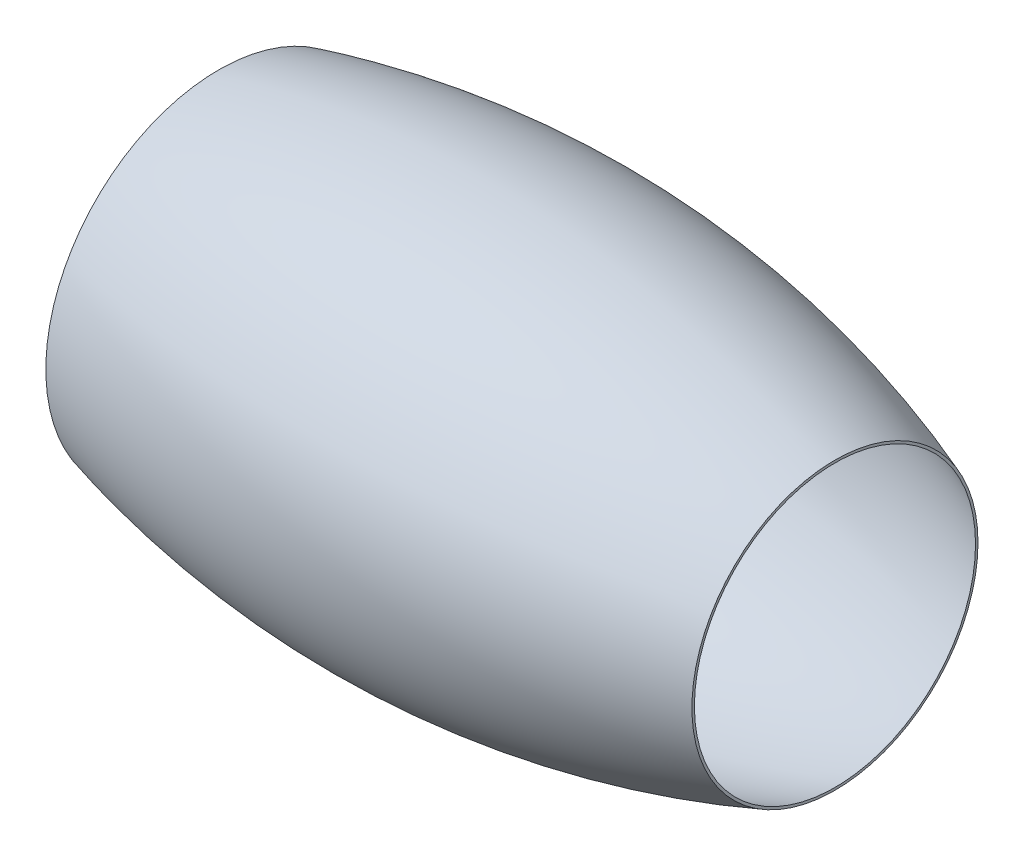
ISO-10303-21;
HEADER;
FILE_DESCRIPTION(('STEP AP214'),'2;1');
FILE_NAME('part.step','',(''),(''),'','','');
FILE_SCHEMA(('AUTOMOTIVE_DESIGN { 1 0 10303 214 1 1 1 1 }'));
ENDSEC;
DATA;
#1=APPLICATION_CONTEXT('core data for automotive mechanical design processes');
#2=APPLICATION_PROTOCOL_DEFINITION('international standard','automotive_design',2000,#1);
#3=PRODUCT_CONTEXT('',#1,'mechanical');
#4=PRODUCT('Part','Part','',(#3));
#5=PRODUCT_RELATED_PRODUCT_CATEGORY('part','',(#4));
#6=PRODUCT_DEFINITION_FORMATION('','',#4);
#7=PRODUCT_DEFINITION_CONTEXT('part definition',#1,'design');
#8=PRODUCT_DEFINITION('design','',#6,#7);
#9=PRODUCT_DEFINITION_SHAPE('','',#8);
#10=(LENGTH_UNIT() NAMED_UNIT(*) SI_UNIT(.MILLI.,.METRE.));
#11=(NAMED_UNIT(*) PLANE_ANGLE_UNIT() SI_UNIT($,.RADIAN.));
#12=(NAMED_UNIT(*) SI_UNIT($,.STERADIAN.) SOLID_ANGLE_UNIT());
#13=UNCERTAINTY_MEASURE_WITH_UNIT(LENGTH_MEASURE(1.E-05),#10,'distance_accuracy_value','');
#14=(GEOMETRIC_REPRESENTATION_CONTEXT(3) GLOBAL_UNCERTAINTY_ASSIGNED_CONTEXT((#13)) GLOBAL_UNIT_ASSIGNED_CONTEXT((#10,
#11,#12)) REPRESENTATION_CONTEXT('',''));
#15=CARTESIAN_POINT('',(0.,0.,0.));
#16=DIRECTION('',(0.,0.,1.));
#17=DIRECTION('',(1.,0.,0.));
#18=AXIS2_PLACEMENT_3D('',#15,#16,#17);
#19=CARTESIAN_POINT('',(-1.89037485552945,0.,0.));
#20=DIRECTION('',(-1.,0.,0.));
#21=DIRECTION('',(0.,0.,1.));
#22=AXIS2_PLACEMENT_3D('',#19,#20,#21);
#23=CONICAL_SURFACE('',#22,278.646084921655,1.30899693899574);
#24=CARTESIAN_POINT('',(-1.1139177202219,0.,0.));
#25=DIRECTION('',(1.,0.,0.));
#26=DIRECTION('',(0.,0.,-1.));
#27=AXIS2_PLACEMENT_3D('',#24,#25,#26);
#28=CIRCLE('',#27,275.748307442788);
#29=CARTESIAN_POINT('',(-1.1139177202219,0.,-275.748307442788));
#30=VERTEX_POINT('',#29);
#31=EDGE_CURVE('E10',#30,#30,#28,.T.);
#32=ORIENTED_EDGE('',*,*,#31,.T.);
#33=EDGE_LOOP('',(#32));
#34=FACE_BOUND('',#33,.T.);
#35=CARTESIAN_POINT('',(-1.89037485552945,0.,0.));
#36=DIRECTION('',(1.,0.,0.));
#37=DIRECTION('',(0.,0.,-1.));
#38=AXIS2_PLACEMENT_3D('',#35,#36,#37);
#39=CIRCLE('',#38,278.646084921655);
#40=CARTESIAN_POINT('',(-1.89037485552945,0.,-278.646084921655));
#41=VERTEX_POINT('',#40);
#42=EDGE_CURVE('E67',#41,#41,#39,.T.);
#43=ORIENTED_EDGE('',*,*,#42,.F.);
#44=EDGE_LOOP('',(#43));
#45=FACE_BOUND('',#44,.T.);
#46=ADVANCED_FACE('F40',(#34,#45),#23,.F.);
#47=CARTESIAN_POINT('',(417.223676658995,0.,0.));
#48=DIRECTION('',(1.,0.,0.));
#49=DIRECTION('',(0.,0.,-1.));
#50=AXIS2_PLACEMENT_3D('',#47,#48,#49);
#51=DEGENERATE_TOROIDAL_SURFACE('',#50,1316.20321729941,1646.,.F.);
#52=CARTESIAN_POINT('',(989.82361909795,0.,0.));
#53=DIRECTION('',(1.,0.,0.));
#54=DIRECTION('',(0.,0.,-1.));
#55=AXIS2_PLACEMENT_3D('',#52,#53,#54);
#56=CIRCLE('',#55,226.99);
#57=CARTESIAN_POINT('',(989.82361909795,0.,-226.99));
#58=VERTEX_POINT('',#57);
#59=EDGE_CURVE('E47',#58,#58,#56,.T.);
#60=ORIENTED_EDGE('',*,*,#59,.T.);
#61=EDGE_LOOP('',(#60));
#62=FACE_BOUND('',#61,.T.);
#63=ORIENTED_EDGE('',*,*,#31,.F.);
#64=EDGE_LOOP('',(#63));
#65=FACE_BOUND('',#64,.T.);
#66=ADVANCED_FACE('F76',(#62,#65),#51,.T.);
#67=CARTESIAN_POINT('',(989.82361909795,0.,0.));
#68=DIRECTION('',(-1.,0.,0.));
#69=DIRECTION('',(0.,0.,1.));
#70=AXIS2_PLACEMENT_3D('',#67,#68,#69);
#71=PLANE('',#70);
#72=ORIENTED_EDGE('',*,*,#59,.F.);
#73=EDGE_LOOP('',(#72));
#74=FACE_BOUND('',#73,.T.);
#75=CARTESIAN_POINT('',(989.82361909795,0.,0.));
#76=DIRECTION('',(1.,0.,0.));
#77=DIRECTION('',(0.,0.,-1.));
#78=AXIS2_PLACEMENT_3D('',#75,#76,#77);
#79=CIRCLE('',#78,230.99);
#80=CARTESIAN_POINT('',(989.82361909795,0.,-230.99));
#81=VERTEX_POINT('',#80);
#82=EDGE_CURVE('E52',#81,#81,#79,.T.);
#83=ORIENTED_EDGE('',*,*,#82,.T.);
#84=EDGE_LOOP('',(#83));
#85=FACE_BOUND('',#84,.T.);
#86=ADVANCED_FACE('F80',(#74,#85),#71,.F.);
#87=CARTESIAN_POINT('',(416.009566884854,0.,0.));
#88=DIRECTION('',(1.,0.,0.));
#89=DIRECTION('',(0.,0.,-1.));
#90=AXIS2_PLACEMENT_3D('',#87,#88,#89);
#91=DEGENERATE_TOROIDAL_SURFACE('',#90,1316.01918985079,1650.,.F.);
#92=ORIENTED_EDGE('',*,*,#82,.F.);
#93=EDGE_LOOP('',(#92));
#94=FACE_BOUND('',#93,.T.);
#95=CARTESIAN_POINT('',(-5.17638090205041,0.,0.));
#96=DIRECTION('',(1.,0.,0.));
#97=DIRECTION('',(0.,0.,-1.));
#98=AXIS2_PLACEMENT_3D('',#95,#96,#97);
#99=CIRCLE('',#98,279.318516525781);
#100=CARTESIAN_POINT('',(-5.17638090205041,0.,-279.318516525781));
#101=VERTEX_POINT('',#100);
#102=EDGE_CURVE('E57',#101,#101,#99,.T.);
#103=ORIENTED_EDGE('',*,*,#102,.T.);
#104=EDGE_LOOP('',(#103));
#105=FACE_BOUND('',#104,.T.);
#106=ADVANCED_FACE('F84',(#94,#105),#91,.F.);
#107=CARTESIAN_POINT('',(-5.17638090205041,0.,0.));
#108=DIRECTION('',(-1.,0.,0.));
#109=DIRECTION('',(0.,0.,1.));
#110=AXIS2_PLACEMENT_3D('',#107,#108,#109);
#111=CONICAL_SURFACE('',#110,279.318516525781,1.30899693899577);
#112=CARTESIAN_POINT('',(-4.78815233439667,0.,0.));
#113=DIRECTION('',(1.,0.,0.));
#114=DIRECTION('',(0.,0.,-1.));
#115=AXIS2_PLACEMENT_3D('',#112,#113,#114);
#116=CIRCLE('',#115,277.869627786348);
#117=CARTESIAN_POINT('',(-4.78815233439667,0.,-277.869627786348));
#118=VERTEX_POINT('',#117);
#119=EDGE_CURVE('E63',#118,#118,#116,.T.);
#120=ORIENTED_EDGE('',*,*,#119,.T.);
#121=EDGE_LOOP('',(#120));
#122=FACE_BOUND('',#121,.T.);
#123=ORIENTED_EDGE('',*,*,#102,.F.);
#124=EDGE_LOOP('',(#123));
#125=FACE_BOUND('',#124,.T.);
#126=ADVANCED_FACE('F91',(#122,#125),#111,.F.);
#127=CARTESIAN_POINT('',(-4.78815233439667,0.,0.));
#128=DIRECTION('',(1.,0.,0.));
#129=DIRECTION('',(0.,0.,-1.));
#130=AXIS2_PLACEMENT_3D('',#127,#128,#129);
#131=CONICAL_SURFACE('',#130,277.869627786348,0.261799387799163);
#132=ORIENTED_EDGE('',*,*,#42,.T.);
#133=EDGE_LOOP('',(#132));
#134=FACE_BOUND('',#133,.T.);
#135=ORIENTED_EDGE('',*,*,#119,.F.);
#136=EDGE_LOOP('',(#135));
#137=FACE_BOUND('',#136,.T.);
#138=ADVANCED_FACE('F72',(#134,#137),#131,.F.);
#139=CLOSED_SHELL('',(#46,#66,#86,#106,#126,#138));
#140=MANIFOLD_SOLID_BREP('B2',#139);
#141=ADVANCED_BREP_SHAPE_REPRESENTATION('',(#18,#140),#14);
#142=SHAPE_DEFINITION_REPRESENTATION(#9,#141);
ENDSEC;
END-ISO-10303-21;
